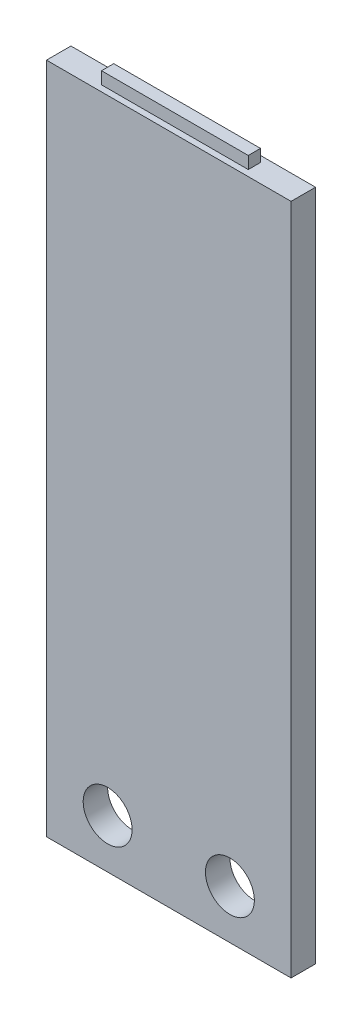
ISO-10303-21;
HEADER;
FILE_DESCRIPTION(('STEP AP214'),'2;1');
FILE_NAME('part.step','',(''),(''),'','','');
FILE_SCHEMA(('AUTOMOTIVE_DESIGN { 1 0 10303 214 1 1 1 1 }'));
ENDSEC;
DATA;
#1=APPLICATION_CONTEXT('core data for automotive mechanical design processes');
#2=APPLICATION_PROTOCOL_DEFINITION('international standard','automotive_design',2000,#1);
#3=PRODUCT_CONTEXT('',#1,'mechanical');
#4=PRODUCT('Part','Part','',(#3));
#5=PRODUCT_RELATED_PRODUCT_CATEGORY('part','',(#4));
#6=PRODUCT_DEFINITION_FORMATION('','',#4);
#7=PRODUCT_DEFINITION_CONTEXT('part definition',#1,'design');
#8=PRODUCT_DEFINITION('design','',#6,#7);
#9=PRODUCT_DEFINITION_SHAPE('','',#8);
#10=(LENGTH_UNIT() NAMED_UNIT(*) SI_UNIT(.MILLI.,.METRE.));
#11=(NAMED_UNIT(*) PLANE_ANGLE_UNIT() SI_UNIT($,.RADIAN.));
#12=(NAMED_UNIT(*) SI_UNIT($,.STERADIAN.) SOLID_ANGLE_UNIT());
#13=UNCERTAINTY_MEASURE_WITH_UNIT(LENGTH_MEASURE(1.E-05),#10,'distance_accuracy_value','');
#14=(GEOMETRIC_REPRESENTATION_CONTEXT(3) GLOBAL_UNCERTAINTY_ASSIGNED_CONTEXT((#13)) GLOBAL_UNIT_ASSIGNED_CONTEXT((#10,
#11,#12)) REPRESENTATION_CONTEXT('',''));
#15=CARTESIAN_POINT('',(0.,0.,0.));
#16=DIRECTION('',(0.,0.,1.));
#17=DIRECTION('',(1.,0.,0.));
#18=AXIS2_PLACEMENT_3D('',#15,#16,#17);
#19=CARTESIAN_POINT('',(50.,137.5,10.));
#20=DIRECTION('',(0.,-1.,0.));
#21=DIRECTION('',(0.,0.,-1.));
#22=AXIS2_PLACEMENT_3D('',#19,#20,#21);
#23=PLANE('',#22);
#24=DIRECTION('',(-1.,0.,0.));
#25=VECTOR('',#24,1.);
#26=CARTESIAN_POINT('',(50.,137.5,0.));
#27=LINE('',#26,#25);
#28=CARTESIAN_POINT('',(50.,137.5,0.));
#29=VERTEX_POINT('',#28);
#30=CARTESIAN_POINT('',(-50.,137.5,0.));
#31=VERTEX_POINT('',#30);
#32=EDGE_CURVE('E137',#29,#31,#27,.T.);
#33=ORIENTED_EDGE('',*,*,#32,.T.);
#34=DIRECTION('',(0.,0.,-1.));
#35=VECTOR('',#34,1.);
#36=CARTESIAN_POINT('',(-50.,137.5,10.));
#37=LINE('',#36,#35);
#38=CARTESIAN_POINT('',(-50.,137.5,10.));
#39=VERTEX_POINT('',#38);
#40=EDGE_CURVE('E142',#39,#31,#37,.T.);
#41=ORIENTED_EDGE('',*,*,#40,.F.);
#42=DIRECTION('',(-1.,0.,0.));
#43=VECTOR('',#42,1.);
#44=CARTESIAN_POINT('',(50.,137.5,10.));
#45=LINE('',#44,#43);
#46=CARTESIAN_POINT('',(50.,137.5,10.));
#47=VERTEX_POINT('',#46);
#48=EDGE_CURVE('E141',#47,#39,#45,.T.);
#49=ORIENTED_EDGE('',*,*,#48,.F.);
#50=DIRECTION('',(0.,0.,-1.));
#51=VECTOR('',#50,1.);
#52=CARTESIAN_POINT('',(50.,137.5,10.));
#53=LINE('',#52,#51);
#54=EDGE_CURVE('E150',#47,#29,#53,.T.);
#55=ORIENTED_EDGE('',*,*,#54,.T.);
#56=EDGE_LOOP('',(#33,#41,#49,#55));
#57=FACE_BOUND('',#56,.T.);
#58=DIRECTION('',(0.,0.,1.));
#59=VECTOR('',#58,1.);
#60=CARTESIAN_POINT('',(-30.,137.5,7.5));
#61=LINE('',#60,#59);
#62=CARTESIAN_POINT('',(-30.,137.5,2.5));
#63=VERTEX_POINT('',#62);
#64=CARTESIAN_POINT('',(-30.,137.5,7.5));
#65=VERTEX_POINT('',#64);
#66=EDGE_CURVE('E54',#63,#65,#61,.T.);
#67=ORIENTED_EDGE('',*,*,#66,.F.);
#68=DIRECTION('',(-1.,0.,0.));
#69=VECTOR('',#68,1.);
#70=CARTESIAN_POINT('',(30.,137.5,2.49999999999999));
#71=LINE('',#70,#69);
#72=CARTESIAN_POINT('',(30.,137.5,2.49999999999999));
#73=VERTEX_POINT('',#72);
#74=EDGE_CURVE('E58',#73,#63,#71,.T.);
#75=ORIENTED_EDGE('',*,*,#74,.F.);
#76=DIRECTION('',(0.,0.,-1.));
#77=VECTOR('',#76,1.);
#78=CARTESIAN_POINT('',(30.,137.5,7.49999999999999));
#79=LINE('',#78,#77);
#80=CARTESIAN_POINT('',(30.,137.5,7.49999999999999));
#81=VERTEX_POINT('',#80);
#82=EDGE_CURVE('E235',#81,#73,#79,.T.);
#83=ORIENTED_EDGE('',*,*,#82,.F.);
#84=DIRECTION('',(1.,0.,0.));
#85=VECTOR('',#84,1.);
#86=CARTESIAN_POINT('',(30.,137.5,7.49999999999999));
#87=LINE('',#86,#85);
#88=EDGE_CURVE('E233',#65,#81,#87,.T.);
#89=ORIENTED_EDGE('',*,*,#88,.F.);
#90=EDGE_LOOP('',(#67,#75,#83,#89));
#91=FACE_BOUND('',#90,.T.);
#92=ADVANCED_FACE('F39',(#57,#91),#23,.F.);
#93=CARTESIAN_POINT('',(-50.,-137.5,10.));
#94=DIRECTION('',(1.,0.,0.));
#95=DIRECTION('',(0.,0.,-1.));
#96=AXIS2_PLACEMENT_3D('',#93,#94,#95);
#97=PLANE('',#96);
#98=DIRECTION('',(0.,-1.,0.));
#99=VECTOR('',#98,1.);
#100=CARTESIAN_POINT('',(-50.,-137.5,0.));
#101=LINE('',#100,#99);
#102=CARTESIAN_POINT('',(-50.,-137.5,0.));
#103=VERTEX_POINT('',#102);
#104=EDGE_CURVE('E124',#31,#103,#101,.T.);
#105=ORIENTED_EDGE('',*,*,#104,.T.);
#106=DIRECTION('',(0.,0.,-1.));
#107=VECTOR('',#106,1.);
#108=CARTESIAN_POINT('',(-50.,-137.5,10.));
#109=LINE('',#108,#107);
#110=CARTESIAN_POINT('',(-50.,-137.5,10.));
#111=VERTEX_POINT('',#110);
#112=EDGE_CURVE('E11',#111,#103,#109,.T.);
#113=ORIENTED_EDGE('',*,*,#112,.F.);
#114=DIRECTION('',(0.,-1.,0.));
#115=VECTOR('',#114,1.);
#116=CARTESIAN_POINT('',(-50.,-137.5,10.));
#117=LINE('',#116,#115);
#118=EDGE_CURVE('E133',#39,#111,#117,.T.);
#119=ORIENTED_EDGE('',*,*,#118,.F.);
#120=ORIENTED_EDGE('',*,*,#40,.T.);
#121=EDGE_LOOP('',(#105,#113,#119,#120));
#122=FACE_BOUND('',#121,.T.);
#123=ADVANCED_FACE('F41',(#122),#97,.F.);
#124=CARTESIAN_POINT('',(50.,-137.5,10.));
#125=DIRECTION('',(0.,1.,0.));
#126=DIRECTION('',(0.,0.,1.));
#127=AXIS2_PLACEMENT_3D('',#124,#125,#126);
#128=PLANE('',#127);
#129=DIRECTION('',(1.,0.,0.));
#130=VECTOR('',#129,1.);
#131=CARTESIAN_POINT('',(50.,-137.5,0.));
#132=LINE('',#131,#130);
#133=CARTESIAN_POINT('',(50.,-137.5,0.));
#134=VERTEX_POINT('',#133);
#135=EDGE_CURVE('E127',#103,#134,#132,.T.);
#136=ORIENTED_EDGE('',*,*,#135,.T.);
#137=DIRECTION('',(0.,0.,-1.));
#138=VECTOR('',#137,1.);
#139=CARTESIAN_POINT('',(50.,-137.5,10.));
#140=LINE('',#139,#138);
#141=CARTESIAN_POINT('',(50.,-137.5,10.));
#142=VERTEX_POINT('',#141);
#143=EDGE_CURVE('E47',#142,#134,#140,.T.);
#144=ORIENTED_EDGE('',*,*,#143,.F.);
#145=DIRECTION('',(1.,0.,0.));
#146=VECTOR('',#145,1.);
#147=CARTESIAN_POINT('',(50.,-137.5,10.));
#148=LINE('',#147,#146);
#149=EDGE_CURVE('E136',#111,#142,#148,.T.);
#150=ORIENTED_EDGE('',*,*,#149,.F.);
#151=ORIENTED_EDGE('',*,*,#112,.T.);
#152=EDGE_LOOP('',(#136,#144,#150,#151));
#153=FACE_BOUND('',#152,.T.);
#154=ADVANCED_FACE('F172',(#153),#128,.F.);
#155=CARTESIAN_POINT('',(50.,-137.5,10.));
#156=DIRECTION('',(-1.,0.,0.));
#157=DIRECTION('',(0.,0.,1.));
#158=AXIS2_PLACEMENT_3D('',#155,#156,#157);
#159=PLANE('',#158);
#160=DIRECTION('',(0.,1.,0.));
#161=VECTOR('',#160,1.);
#162=CARTESIAN_POINT('',(50.,-137.5,0.));
#163=LINE('',#162,#161);
#164=EDGE_CURVE('E145',#134,#29,#163,.T.);
#165=ORIENTED_EDGE('',*,*,#164,.T.);
#166=ORIENTED_EDGE('',*,*,#54,.F.);
#167=DIRECTION('',(0.,1.,0.));
#168=VECTOR('',#167,1.);
#169=CARTESIAN_POINT('',(50.,-137.5,10.));
#170=LINE('',#169,#168);
#171=EDGE_CURVE('E139',#142,#47,#170,.T.);
#172=ORIENTED_EDGE('',*,*,#171,.F.);
#173=ORIENTED_EDGE('',*,*,#143,.T.);
#174=EDGE_LOOP('',(#165,#166,#172,#173));
#175=FACE_BOUND('',#174,.T.);
#176=ADVANCED_FACE('F157',(#175),#159,.F.);
#177=CARTESIAN_POINT('',(0.,0.,10.));
#178=DIRECTION('',(0.,0.,1.));
#179=DIRECTION('',(1.,0.,0.));
#180=AXIS2_PLACEMENT_3D('',#177,#178,#179);
#181=PLANE('',#180);
#182=CARTESIAN_POINT('',(25.,-117.5,10.));
#183=DIRECTION('',(0.,0.,1.));
#184=DIRECTION('',(1.,0.,0.));
#185=AXIS2_PLACEMENT_3D('',#182,#183,#184);
#186=CIRCLE('',#185,10.);
#187=CARTESIAN_POINT('',(35.,-117.5,10.));
#188=VERTEX_POINT('',#187);
#189=EDGE_CURVE('E219',#188,#188,#186,.T.);
#190=ORIENTED_EDGE('',*,*,#189,.F.);
#191=EDGE_LOOP('',(#190));
#192=FACE_BOUND('',#191,.T.);
#193=CARTESIAN_POINT('',(-25.,-117.5,10.));
#194=DIRECTION('',(0.,0.,1.));
#195=DIRECTION('',(-1.,0.,0.));
#196=AXIS2_PLACEMENT_3D('',#193,#194,#195);
#197=CIRCLE('',#196,10.);
#198=CARTESIAN_POINT('',(-35.,-117.5,10.));
#199=VERTEX_POINT('',#198);
#200=EDGE_CURVE('E224',#199,#199,#197,.T.);
#201=ORIENTED_EDGE('',*,*,#200,.F.);
#202=EDGE_LOOP('',(#201));
#203=FACE_BOUND('',#202,.T.);
#204=ORIENTED_EDGE('',*,*,#118,.T.);
#205=ORIENTED_EDGE('',*,*,#149,.T.);
#206=ORIENTED_EDGE('',*,*,#171,.T.);
#207=ORIENTED_EDGE('',*,*,#48,.T.);
#208=EDGE_LOOP('',(#204,#205,#206,#207));
#209=FACE_BOUND('',#208,.T.);
#210=ADVANCED_FACE('F171',(#192,#203,#209),#181,.T.);
#211=CARTESIAN_POINT('',(0.,0.,0.));
#212=DIRECTION('',(0.,0.,1.));
#213=DIRECTION('',(1.,0.,0.));
#214=AXIS2_PLACEMENT_3D('',#211,#212,#213);
#215=PLANE('',#214);
#216=CARTESIAN_POINT('',(25.,-117.5,0.));
#217=DIRECTION('',(0.,0.,1.));
#218=DIRECTION('',(1.,0.,0.));
#219=AXIS2_PLACEMENT_3D('',#216,#217,#218);
#220=CIRCLE('',#219,10.);
#221=CARTESIAN_POINT('',(35.,-117.5,0.));
#222=VERTEX_POINT('',#221);
#223=EDGE_CURVE('E216',#222,#222,#220,.T.);
#224=ORIENTED_EDGE('',*,*,#223,.T.);
#225=EDGE_LOOP('',(#224));
#226=FACE_BOUND('',#225,.T.);
#227=CARTESIAN_POINT('',(-25.,-117.5,0.));
#228=DIRECTION('',(0.,0.,1.));
#229=DIRECTION('',(-1.,0.,0.));
#230=AXIS2_PLACEMENT_3D('',#227,#228,#229);
#231=CIRCLE('',#230,10.);
#232=CARTESIAN_POINT('',(-35.,-117.5,0.));
#233=VERTEX_POINT('',#232);
#234=EDGE_CURVE('E220',#233,#233,#231,.T.);
#235=ORIENTED_EDGE('',*,*,#234,.T.);
#236=EDGE_LOOP('',(#235));
#237=FACE_BOUND('',#236,.T.);
#238=ORIENTED_EDGE('',*,*,#104,.F.);
#239=ORIENTED_EDGE('',*,*,#32,.F.);
#240=ORIENTED_EDGE('',*,*,#164,.F.);
#241=ORIENTED_EDGE('',*,*,#135,.F.);
#242=EDGE_LOOP('',(#238,#239,#240,#241));
#243=FACE_BOUND('',#242,.T.);
#244=ADVANCED_FACE('F163',(#226,#237,#243),#215,.F.);
#245=CARTESIAN_POINT('',(-30.,142.5,7.5));
#246=DIRECTION('',(1.,0.,0.));
#247=DIRECTION('',(0.,0.,-1.));
#248=AXIS2_PLACEMENT_3D('',#245,#246,#247);
#249=PLANE('',#248);
#250=ORIENTED_EDGE('',*,*,#66,.T.);
#251=DIRECTION('',(0.,-1.,0.));
#252=VECTOR('',#251,1.);
#253=CARTESIAN_POINT('',(-30.,142.5,7.5));
#254=LINE('',#253,#252);
#255=CARTESIAN_POINT('',(-30.,142.5,7.5));
#256=VERTEX_POINT('',#255);
#257=EDGE_CURVE('E107',#256,#65,#254,.T.);
#258=ORIENTED_EDGE('',*,*,#257,.F.);
#259=DIRECTION('',(0.,0.,1.));
#260=VECTOR('',#259,1.);
#261=CARTESIAN_POINT('',(-30.,142.5,7.5));
#262=LINE('',#261,#260);
#263=CARTESIAN_POINT('',(-30.,142.5,2.5));
#264=VERTEX_POINT('',#263);
#265=EDGE_CURVE('E113',#264,#256,#262,.T.);
#266=ORIENTED_EDGE('',*,*,#265,.F.);
#267=DIRECTION('',(0.,-1.,0.));
#268=VECTOR('',#267,1.);
#269=CARTESIAN_POINT('',(-30.,142.5,2.5));
#270=LINE('',#269,#268);
#271=EDGE_CURVE('E231',#264,#63,#270,.T.);
#272=ORIENTED_EDGE('',*,*,#271,.T.);
#273=EDGE_LOOP('',(#250,#258,#266,#272));
#274=FACE_BOUND('',#273,.T.);
#275=ADVANCED_FACE('F123',(#274),#249,.F.);
#276=CARTESIAN_POINT('',(30.,142.5,7.49999999999999));
#277=DIRECTION('',(0.,0.,-1.));
#278=DIRECTION('',(-1.,0.,0.));
#279=AXIS2_PLACEMENT_3D('',#276,#277,#278);
#280=PLANE('',#279);
#281=ORIENTED_EDGE('',*,*,#88,.T.);
#282=DIRECTION('',(0.,-1.,0.));
#283=VECTOR('',#282,1.);
#284=CARTESIAN_POINT('',(30.,142.5,7.49999999999999));
#285=LINE('',#284,#283);
#286=CARTESIAN_POINT('',(30.,142.5,7.49999999999999));
#287=VERTEX_POINT('',#286);
#288=EDGE_CURVE('E109',#287,#81,#285,.T.);
#289=ORIENTED_EDGE('',*,*,#288,.F.);
#290=DIRECTION('',(1.,0.,0.));
#291=VECTOR('',#290,1.);
#292=CARTESIAN_POINT('',(30.,142.5,7.49999999999999));
#293=LINE('',#292,#291);
#294=EDGE_CURVE('E102',#256,#287,#293,.T.);
#295=ORIENTED_EDGE('',*,*,#294,.F.);
#296=ORIENTED_EDGE('',*,*,#257,.T.);
#297=EDGE_LOOP('',(#281,#289,#295,#296));
#298=FACE_BOUND('',#297,.T.);
#299=ADVANCED_FACE('F105',(#298),#280,.F.);
#300=CARTESIAN_POINT('',(30.,142.5,7.49999999999999));
#301=DIRECTION('',(-1.,0.,0.));
#302=DIRECTION('',(0.,0.,1.));
#303=AXIS2_PLACEMENT_3D('',#300,#301,#302);
#304=PLANE('',#303);
#305=ORIENTED_EDGE('',*,*,#82,.T.);
#306=DIRECTION('',(0.,-1.,0.));
#307=VECTOR('',#306,1.);
#308=CARTESIAN_POINT('',(30.,142.5,2.49999999999999));
#309=LINE('',#308,#307);
#310=CARTESIAN_POINT('',(30.,142.5,2.49999999999999));
#311=VERTEX_POINT('',#310);
#312=EDGE_CURVE('E129',#311,#73,#309,.T.);
#313=ORIENTED_EDGE('',*,*,#312,.F.);
#314=DIRECTION('',(0.,0.,-1.));
#315=VECTOR('',#314,1.);
#316=CARTESIAN_POINT('',(30.,142.5,7.49999999999999));
#317=LINE('',#316,#315);
#318=EDGE_CURVE('E112',#287,#311,#317,.T.);
#319=ORIENTED_EDGE('',*,*,#318,.F.);
#320=ORIENTED_EDGE('',*,*,#288,.T.);
#321=EDGE_LOOP('',(#305,#313,#319,#320));
#322=FACE_BOUND('',#321,.T.);
#323=ADVANCED_FACE('F194',(#322),#304,.F.);
#324=CARTESIAN_POINT('',(30.,142.5,2.49999999999999));
#325=DIRECTION('',(0.,0.,1.));
#326=DIRECTION('',(1.,0.,0.));
#327=AXIS2_PLACEMENT_3D('',#324,#325,#326);
#328=PLANE('',#327);
#329=ORIENTED_EDGE('',*,*,#74,.T.);
#330=ORIENTED_EDGE('',*,*,#271,.F.);
#331=DIRECTION('',(-1.,0.,0.));
#332=VECTOR('',#331,1.);
#333=CARTESIAN_POINT('',(30.,142.5,2.49999999999999));
#334=LINE('',#333,#332);
#335=EDGE_CURVE('E118',#311,#264,#334,.T.);
#336=ORIENTED_EDGE('',*,*,#335,.F.);
#337=ORIENTED_EDGE('',*,*,#312,.T.);
#338=EDGE_LOOP('',(#329,#330,#336,#337));
#339=FACE_BOUND('',#338,.T.);
#340=ADVANCED_FACE('F197',(#339),#328,.F.);
#341=CARTESIAN_POINT('',(0.,142.5,0.));
#342=DIRECTION('',(0.,1.,0.));
#343=DIRECTION('',(0.,0.,1.));
#344=AXIS2_PLACEMENT_3D('',#341,#342,#343);
#345=PLANE('',#344);
#346=ORIENTED_EDGE('',*,*,#265,.T.);
#347=ORIENTED_EDGE('',*,*,#294,.T.);
#348=ORIENTED_EDGE('',*,*,#318,.T.);
#349=ORIENTED_EDGE('',*,*,#335,.T.);
#350=EDGE_LOOP('',(#346,#347,#348,#349));
#351=FACE_BOUND('',#350,.T.);
#352=ADVANCED_FACE('F116',(#351),#345,.T.);
#353=CARTESIAN_POINT('',(-25.,-117.5,0.));
#354=DIRECTION('',(0.,0.,1.));
#355=DIRECTION('',(1.,0.,0.));
#356=AXIS2_PLACEMENT_3D('',#353,#354,#355);
#357=CYLINDRICAL_SURFACE('',#356,10.);
#358=ORIENTED_EDGE('',*,*,#234,.F.);
#359=EDGE_LOOP('',(#358));
#360=FACE_BOUND('',#359,.T.);
#361=ORIENTED_EDGE('',*,*,#200,.T.);
#362=EDGE_LOOP('',(#361));
#363=FACE_BOUND('',#362,.T.);
#364=ADVANCED_FACE('F204',(#360,#363),#357,.F.);
#365=CARTESIAN_POINT('',(25.,-117.5,0.));
#366=DIRECTION('',(0.,0.,1.));
#367=DIRECTION('',(1.,0.,0.));
#368=AXIS2_PLACEMENT_3D('',#365,#366,#367);
#369=CYLINDRICAL_SURFACE('',#368,10.);
#370=ORIENTED_EDGE('',*,*,#223,.F.);
#371=EDGE_LOOP('',(#370));
#372=FACE_BOUND('',#371,.T.);
#373=ORIENTED_EDGE('',*,*,#189,.T.);
#374=EDGE_LOOP('',(#373));
#375=FACE_BOUND('',#374,.T.);
#376=ADVANCED_FACE('F207',(#372,#375),#369,.F.);
#377=CLOSED_SHELL('',(#92,#123,#154,#176,#210,#244,#275,#299,#323,#340,#352,#364,#376));
#378=MANIFOLD_SOLID_BREP('B2',#377);
#379=ADVANCED_BREP_SHAPE_REPRESENTATION('',(#18,#378),#14);
#380=SHAPE_DEFINITION_REPRESENTATION(#9,#379);
ENDSEC;
END-ISO-10303-21;
